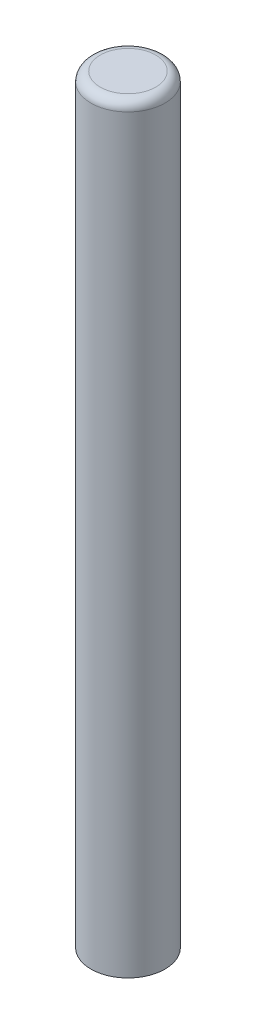
ISO-10303-21;
HEADER;
FILE_DESCRIPTION(('STEP AP214'),'2;1');
FILE_NAME('part.step','',(''),(''),'','','');
FILE_SCHEMA(('AUTOMOTIVE_DESIGN { 1 0 10303 214 1 1 1 1 }'));
ENDSEC;
DATA;
#1=APPLICATION_CONTEXT('core data for automotive mechanical design processes');
#2=APPLICATION_PROTOCOL_DEFINITION('international standard','automotive_design',2000,#1);
#3=PRODUCT_CONTEXT('',#1,'mechanical');
#4=PRODUCT('Part','Part','',(#3));
#5=PRODUCT_RELATED_PRODUCT_CATEGORY('part','',(#4));
#6=PRODUCT_DEFINITION_FORMATION('','',#4);
#7=PRODUCT_DEFINITION_CONTEXT('part definition',#1,'design');
#8=PRODUCT_DEFINITION('design','',#6,#7);
#9=PRODUCT_DEFINITION_SHAPE('','',#8);
#10=(LENGTH_UNIT() NAMED_UNIT(*) SI_UNIT(.MILLI.,.METRE.));
#11=(NAMED_UNIT(*) PLANE_ANGLE_UNIT() SI_UNIT($,.RADIAN.));
#12=(NAMED_UNIT(*) SI_UNIT($,.STERADIAN.) SOLID_ANGLE_UNIT());
#13=UNCERTAINTY_MEASURE_WITH_UNIT(LENGTH_MEASURE(1.E-05),#10,'distance_accuracy_value','');
#14=(GEOMETRIC_REPRESENTATION_CONTEXT(3) GLOBAL_UNCERTAINTY_ASSIGNED_CONTEXT((#13)) GLOBAL_UNIT_ASSIGNED_CONTEXT((#10,
#11,#12)) REPRESENTATION_CONTEXT('',''));
#15=CARTESIAN_POINT('',(0.,0.,0.));
#16=DIRECTION('',(0.,0.,1.));
#17=DIRECTION('',(1.,0.,0.));
#18=AXIS2_PLACEMENT_3D('',#15,#16,#17);
#19=CARTESIAN_POINT('',(0.,20.5,0.));
#20=DIRECTION('',(0.,-1.,0.));
#21=DIRECTION('',(0.,0.,-1.));
#22=AXIS2_PLACEMENT_3D('',#19,#20,#21);
#23=CYLINDRICAL_SURFACE('',#22,1.);
#24=CARTESIAN_POINT('',(0.,20.25,0.));
#25=DIRECTION('',(0.,1.,0.));
#26=DIRECTION('',(0.,0.,1.));
#27=AXIS2_PLACEMENT_3D('',#24,#25,#26);
#28=CIRCLE('',#27,1.);
#29=CARTESIAN_POINT('',(0.,20.25,1.));
#30=VERTEX_POINT('',#29);
#31=EDGE_CURVE('E10',#30,#30,#28,.F.);
#32=ORIENTED_EDGE('',*,*,#31,.T.);
#33=EDGE_LOOP('',(#32));
#34=FACE_BOUND('',#33,.T.);
#35=CARTESIAN_POINT('',(0.,0.,0.));
#36=DIRECTION('',(0.,1.,0.));
#37=DIRECTION('',(0.,0.,1.));
#38=AXIS2_PLACEMENT_3D('',#35,#36,#37);
#39=CIRCLE('',#38,1.);
#40=CARTESIAN_POINT('',(0.,0.,1.));
#41=VERTEX_POINT('',#40);
#42=EDGE_CURVE('E44',#41,#41,#39,.T.);
#43=ORIENTED_EDGE('',*,*,#42,.T.);
#44=EDGE_LOOP('',(#43));
#45=FACE_BOUND('',#44,.T.);
#46=ADVANCED_FACE('F33',(#34,#45),#23,.T.);
#47=CARTESIAN_POINT('',(0.,20.5,0.));
#48=DIRECTION('',(0.,1.,0.));
#49=DIRECTION('',(0.,0.,1.));
#50=AXIS2_PLACEMENT_3D('',#47,#48,#49);
#51=PLANE('',#50);
#52=CARTESIAN_POINT('',(0.,20.5,0.));
#53=DIRECTION('',(0.,1.,0.));
#54=DIRECTION('',(0.,0.,1.));
#55=AXIS2_PLACEMENT_3D('',#52,#53,#54);
#56=CIRCLE('',#55,0.75);
#57=CARTESIAN_POINT('',(0.,20.5,0.75));
#58=VERTEX_POINT('',#57);
#59=EDGE_CURVE('E40',#58,#58,#56,.T.);
#60=ORIENTED_EDGE('',*,*,#59,.T.);
#61=EDGE_LOOP('',(#60));
#62=FACE_BOUND('',#61,.T.);
#63=ADVANCED_FACE('F54',(#62),#51,.T.);
#64=CARTESIAN_POINT('',(0.,0.,0.));
#65=DIRECTION('',(0.,1.,0.));
#66=DIRECTION('',(0.,0.,1.));
#67=AXIS2_PLACEMENT_3D('',#64,#65,#66);
#68=PLANE('',#67);
#69=ORIENTED_EDGE('',*,*,#42,.F.);
#70=EDGE_LOOP('',(#69));
#71=FACE_BOUND('',#70,.T.);
#72=ADVANCED_FACE('F52',(#71),#68,.F.);
#73=CARTESIAN_POINT('',(0.,20.25,0.));
#74=DIRECTION('',(0.,1.,0.));
#75=DIRECTION('',(0.,0.,1.));
#76=AXIS2_PLACEMENT_3D('',#73,#74,#75);
#77=TOROIDAL_SURFACE('',#76,0.75,0.25);
#78=ORIENTED_EDGE('',*,*,#31,.F.);
#79=EDGE_LOOP('',(#78));
#80=FACE_BOUND('',#79,.T.);
#81=ORIENTED_EDGE('',*,*,#59,.F.);
#82=EDGE_LOOP('',(#81));
#83=FACE_BOUND('',#82,.T.);
#84=ADVANCED_FACE('F35',(#80,#83),#77,.T.);
#85=CLOSED_SHELL('',(#46,#63,#72,#84));
#86=MANIFOLD_SOLID_BREP('B2',#85);
#87=ADVANCED_BREP_SHAPE_REPRESENTATION('',(#18,#86),#14);
#88=SHAPE_DEFINITION_REPRESENTATION(#9,#87);
ENDSEC;
END-ISO-10303-21;
